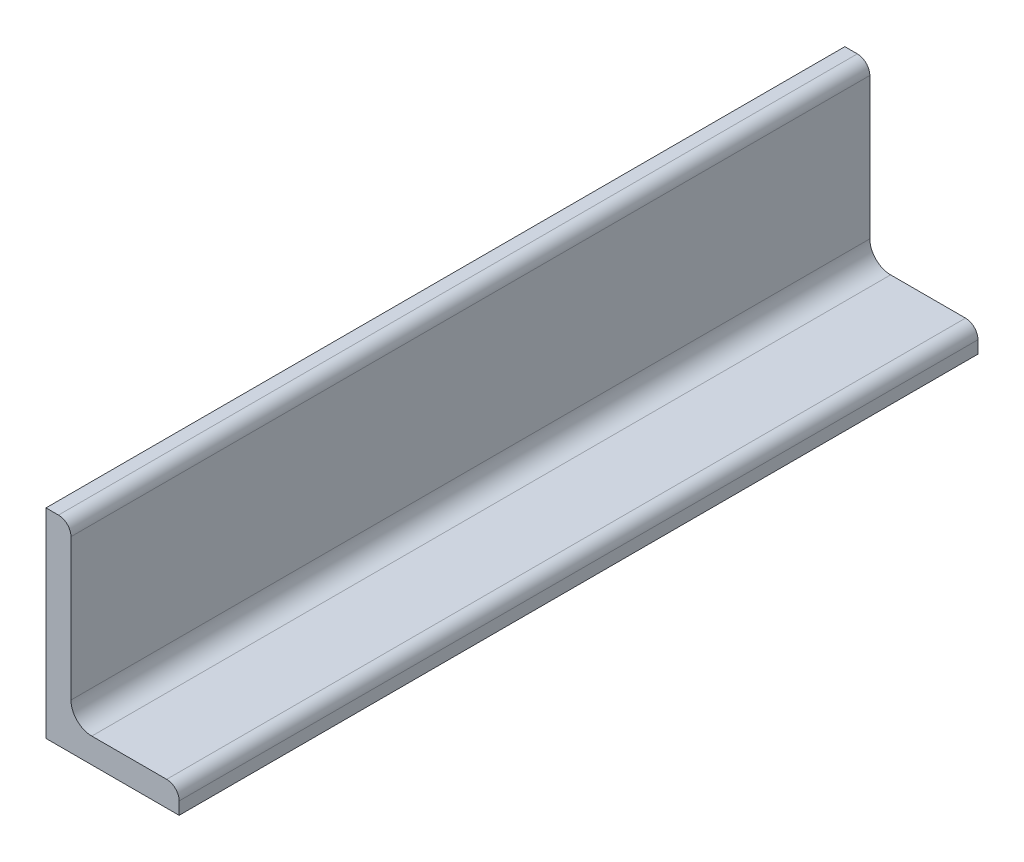
ISO-10303-21;
HEADER;
FILE_DESCRIPTION(('STEP AP214'),'2;1');
FILE_NAME('part.step','',(''),(''),'','','');
FILE_SCHEMA(('AUTOMOTIVE_DESIGN { 1 0 10303 214 1 1 1 1 }'));
ENDSEC;
DATA;
#1=APPLICATION_CONTEXT('core data for automotive mechanical design processes');
#2=APPLICATION_PROTOCOL_DEFINITION('international standard','automotive_design',2000,#1);
#3=PRODUCT_CONTEXT('',#1,'mechanical');
#4=PRODUCT('Part','Part','',(#3));
#5=PRODUCT_RELATED_PRODUCT_CATEGORY('part','',(#4));
#6=PRODUCT_DEFINITION_FORMATION('','',#4);
#7=PRODUCT_DEFINITION_CONTEXT('part definition',#1,'design');
#8=PRODUCT_DEFINITION('design','',#6,#7);
#9=PRODUCT_DEFINITION_SHAPE('','',#8);
#10=(LENGTH_UNIT() NAMED_UNIT(*) SI_UNIT(.MILLI.,.METRE.));
#11=(NAMED_UNIT(*) PLANE_ANGLE_UNIT() SI_UNIT($,.RADIAN.));
#12=(NAMED_UNIT(*) SI_UNIT($,.STERADIAN.) SOLID_ANGLE_UNIT());
#13=UNCERTAINTY_MEASURE_WITH_UNIT(LENGTH_MEASURE(1.E-05),#10,'distance_accuracy_value','');
#14=(GEOMETRIC_REPRESENTATION_CONTEXT(3) GLOBAL_UNCERTAINTY_ASSIGNED_CONTEXT((#13)) GLOBAL_UNIT_ASSIGNED_CONTEXT((#10,
#11,#12)) REPRESENTATION_CONTEXT('',''));
#15=CARTESIAN_POINT('',(0.,0.,0.));
#16=DIRECTION('',(0.,0.,1.));
#17=DIRECTION('',(1.,0.,0.));
#18=AXIS2_PLACEMENT_3D('',#15,#16,#17);
#19=CARTESIAN_POINT('',(0.116507760447575,76.2882459217981,304.8));
#20=DIRECTION('',(1.,0.,0.));
#21=DIRECTION('',(0.,0.,-1.));
#22=AXIS2_PLACEMENT_3D('',#19,#20,#21);
#23=PLANE('',#22);
#24=DIRECTION('',(0.,-1.,0.));
#25=VECTOR('',#24,1.);
#26=CARTESIAN_POINT('',(0.116507760447575,76.2882459217981,0.));
#27=LINE('',#26,#25);
#28=CARTESIAN_POINT('',(0.116507760447575,76.2882459217981,0.));
#29=VERTEX_POINT('',#28);
#30=CARTESIAN_POINT('',(0.116507760447575,0.0882459217980795,0.));
#31=VERTEX_POINT('',#30);
#32=EDGE_CURVE('E135',#29,#31,#27,.T.);
#33=ORIENTED_EDGE('',*,*,#32,.T.);
#34=DIRECTION('',(0.,0.,-1.));
#35=VECTOR('',#34,1.);
#36=CARTESIAN_POINT('',(0.116507760447575,0.0882459217980795,304.8));
#37=LINE('',#36,#35);
#38=CARTESIAN_POINT('',(0.116507760447575,0.0882459217980795,304.8));
#39=VERTEX_POINT('',#38);
#40=EDGE_CURVE('E11',#39,#31,#37,.T.);
#41=ORIENTED_EDGE('',*,*,#40,.F.);
#42=DIRECTION('',(0.,-1.,0.));
#43=VECTOR('',#42,1.);
#44=CARTESIAN_POINT('',(0.116507760447575,76.2882459217981,304.8));
#45=LINE('',#44,#43);
#46=CARTESIAN_POINT('',(0.116507760447575,76.2882459217981,304.8));
#47=VERTEX_POINT('',#46);
#48=EDGE_CURVE('E151',#47,#39,#45,.T.);
#49=ORIENTED_EDGE('',*,*,#48,.F.);
#50=DIRECTION('',(0.,0.,-1.));
#51=VECTOR('',#50,1.);
#52=CARTESIAN_POINT('',(0.116507760447575,76.2882459217981,304.8));
#53=LINE('',#52,#51);
#54=EDGE_CURVE('E131',#47,#29,#53,.T.);
#55=ORIENTED_EDGE('',*,*,#54,.T.);
#56=EDGE_LOOP('',(#33,#41,#49,#55));
#57=FACE_BOUND('',#56,.T.);
#58=ADVANCED_FACE('F33',(#57),#23,.F.);
#59=CARTESIAN_POINT('',(0.116507760447575,0.0882459217980795,304.8));
#60=DIRECTION('',(0.,1.,0.));
#61=DIRECTION('',(0.,0.,1.));
#62=AXIS2_PLACEMENT_3D('',#59,#60,#61);
#63=PLANE('',#62);
#64=DIRECTION('',(1.,0.,0.));
#65=VECTOR('',#64,1.);
#66=CARTESIAN_POINT('',(0.116507760447575,0.0882459217980795,0.));
#67=LINE('',#66,#65);
#68=CARTESIAN_POINT('',(50.9165077604476,0.0882459217980795,0.));
#69=VERTEX_POINT('',#68);
#70=EDGE_CURVE('E138',#31,#69,#67,.T.);
#71=ORIENTED_EDGE('',*,*,#70,.T.);
#72=DIRECTION('',(0.,0.,-1.));
#73=VECTOR('',#72,1.);
#74=CARTESIAN_POINT('',(50.9165077604476,0.0882459217980795,304.8));
#75=LINE('',#74,#73);
#76=CARTESIAN_POINT('',(50.9165077604476,0.0882459217980795,304.8));
#77=VERTEX_POINT('',#76);
#78=EDGE_CURVE('E41',#77,#69,#75,.T.);
#79=ORIENTED_EDGE('',*,*,#78,.F.);
#80=DIRECTION('',(1.,0.,0.));
#81=VECTOR('',#80,1.);
#82=CARTESIAN_POINT('',(0.116507760447575,0.0882459217980795,304.8));
#83=LINE('',#82,#81);
#84=EDGE_CURVE('E95',#39,#77,#83,.T.);
#85=ORIENTED_EDGE('',*,*,#84,.F.);
#86=ORIENTED_EDGE('',*,*,#40,.T.);
#87=EDGE_LOOP('',(#71,#79,#85,#86));
#88=FACE_BOUND('',#87,.T.);
#89=ADVANCED_FACE('F194',(#88),#63,.F.);
#90=CARTESIAN_POINT('',(50.9165077604476,0.0882459217980795,304.8));
#91=DIRECTION('',(-1.,0.,0.));
#92=DIRECTION('',(0.,0.,1.));
#93=AXIS2_PLACEMENT_3D('',#90,#91,#92);
#94=PLANE('',#93);
#95=DIRECTION('',(0.,1.,0.));
#96=VECTOR('',#95,1.);
#97=CARTESIAN_POINT('',(50.9165077604476,0.0882459217980795,0.));
#98=LINE('',#97,#96);
#99=CARTESIAN_POINT('',(50.9165077604476,4.85074592179808,0.));
#100=VERTEX_POINT('',#99);
#101=EDGE_CURVE('E140',#69,#100,#98,.T.);
#102=ORIENTED_EDGE('',*,*,#101,.T.);
#103=DIRECTION('',(0.,0.,-1.));
#104=VECTOR('',#103,1.);
#105=CARTESIAN_POINT('',(50.9165077604476,4.85074592179808,304.8));
#106=LINE('',#105,#104);
#107=CARTESIAN_POINT('',(50.9165077604476,4.85074592179808,304.8));
#108=VERTEX_POINT('',#107);
#109=EDGE_CURVE('E161',#108,#100,#106,.T.);
#110=ORIENTED_EDGE('',*,*,#109,.F.);
#111=DIRECTION('',(0.,1.,0.));
#112=VECTOR('',#111,1.);
#113=CARTESIAN_POINT('',(50.9165077604476,0.0882459217980795,304.8));
#114=LINE('',#113,#112);
#115=EDGE_CURVE('E169',#77,#108,#114,.T.);
#116=ORIENTED_EDGE('',*,*,#115,.F.);
#117=ORIENTED_EDGE('',*,*,#78,.T.);
#118=EDGE_LOOP('',(#102,#110,#116,#117));
#119=FACE_BOUND('',#118,.T.);
#120=ADVANCED_FACE('F167',(#119),#94,.F.);
#121=CARTESIAN_POINT('',(46.1540077604476,4.85074592179808,304.8));
#122=DIRECTION('',(0.,0.,-1.));
#123=DIRECTION('',(-1.,0.,0.));
#124=AXIS2_PLACEMENT_3D('',#121,#122,#123);
#125=CYLINDRICAL_SURFACE('',#124,4.7625);
#126=CARTESIAN_POINT('',(46.1540077604476,4.85074592179808,0.));
#127=DIRECTION('',(0.,0.,1.));
#128=DIRECTION('',(1.,0.,0.));
#129=AXIS2_PLACEMENT_3D('',#126,#127,#128);
#130=CIRCLE('',#129,4.7625);
#131=CARTESIAN_POINT('',(46.1540077604476,9.61324592179808,0.));
#132=VERTEX_POINT('',#131);
#133=EDGE_CURVE('E142',#100,#132,#130,.T.);
#134=ORIENTED_EDGE('',*,*,#133,.T.);
#135=DIRECTION('',(0.,0.,-1.));
#136=VECTOR('',#135,1.);
#137=CARTESIAN_POINT('',(46.1540077604476,9.61324592179808,304.8));
#138=LINE('',#137,#136);
#139=CARTESIAN_POINT('',(46.1540077604476,9.61324592179808,304.8));
#140=VERTEX_POINT('',#139);
#141=EDGE_CURVE('E158',#140,#132,#138,.T.);
#142=ORIENTED_EDGE('',*,*,#141,.F.);
#143=CARTESIAN_POINT('',(46.1540077604476,4.85074592179808,304.8));
#144=DIRECTION('',(0.,0.,1.));
#145=DIRECTION('',(1.,0.,0.));
#146=AXIS2_PLACEMENT_3D('',#143,#144,#145);
#147=CIRCLE('',#146,4.7625);
#148=EDGE_CURVE('E185',#108,#140,#147,.T.);
#149=ORIENTED_EDGE('',*,*,#148,.F.);
#150=ORIENTED_EDGE('',*,*,#109,.T.);
#151=EDGE_LOOP('',(#134,#142,#149,#150));
#152=FACE_BOUND('',#151,.T.);
#153=ADVANCED_FACE('F178',(#152),#125,.T.);
#154=CARTESIAN_POINT('',(46.1540077604476,9.61324592179808,304.8));
#155=DIRECTION('',(0.,-1.,0.));
#156=DIRECTION('',(0.,0.,-1.));
#157=AXIS2_PLACEMENT_3D('',#154,#155,#156);
#158=PLANE('',#157);
#159=DIRECTION('',(-1.,0.,0.));
#160=VECTOR('',#159,1.);
#161=CARTESIAN_POINT('',(46.1540077604476,9.61324592179808,0.));
#162=LINE('',#161,#160);
#163=CARTESIAN_POINT('',(17.5790077604476,9.61324592179808,0.));
#164=VERTEX_POINT('',#163);
#165=EDGE_CURVE('E144',#132,#164,#162,.T.);
#166=ORIENTED_EDGE('',*,*,#165,.T.);
#167=DIRECTION('',(0.,0.,-1.));
#168=VECTOR('',#167,1.);
#169=CARTESIAN_POINT('',(17.5790077604476,9.61324592179808,304.8));
#170=LINE('',#169,#168);
#171=CARTESIAN_POINT('',(17.5790077604476,9.61324592179808,304.8));
#172=VERTEX_POINT('',#171);
#173=EDGE_CURVE('E155',#172,#164,#170,.T.);
#174=ORIENTED_EDGE('',*,*,#173,.F.);
#175=DIRECTION('',(-1.,0.,0.));
#176=VECTOR('',#175,1.);
#177=CARTESIAN_POINT('',(46.1540077604476,9.61324592179808,304.8));
#178=LINE('',#177,#176);
#179=EDGE_CURVE('E184',#140,#172,#178,.T.);
#180=ORIENTED_EDGE('',*,*,#179,.F.);
#181=ORIENTED_EDGE('',*,*,#141,.T.);
#182=EDGE_LOOP('',(#166,#174,#180,#181));
#183=FACE_BOUND('',#182,.T.);
#184=ADVANCED_FACE('F182',(#183),#158,.F.);
#185=CARTESIAN_POINT('',(17.5790077604476,17.5507459217981,304.8));
#186=DIRECTION('',(0.,0.,-1.));
#187=DIRECTION('',(-1.,0.,0.));
#188=AXIS2_PLACEMENT_3D('',#185,#186,#187);
#189=CYLINDRICAL_SURFACE('',#188,7.93749999999999);
#190=CARTESIAN_POINT('',(17.5790077604476,17.5507459217981,0.));
#191=DIRECTION('',(0.,0.,-1.));
#192=DIRECTION('',(1.,0.,0.));
#193=AXIS2_PLACEMENT_3D('',#190,#191,#192);
#194=CIRCLE('',#193,7.93749999999999);
#195=CARTESIAN_POINT('',(9.64150776044757,17.5507459217981,0.));
#196=VERTEX_POINT('',#195);
#197=EDGE_CURVE('E146',#164,#196,#194,.T.);
#198=ORIENTED_EDGE('',*,*,#197,.T.);
#199=DIRECTION('',(0.,0.,-1.));
#200=VECTOR('',#199,1.);
#201=CARTESIAN_POINT('',(9.64150776044757,17.5507459217981,304.8));
#202=LINE('',#201,#200);
#203=CARTESIAN_POINT('',(9.64150776044757,17.5507459217981,304.8));
#204=VERTEX_POINT('',#203);
#205=EDGE_CURVE('E126',#204,#196,#202,.T.);
#206=ORIENTED_EDGE('',*,*,#205,.F.);
#207=CARTESIAN_POINT('',(17.5790077604476,17.5507459217981,304.8));
#208=DIRECTION('',(0.,0.,-1.));
#209=DIRECTION('',(1.,0.,0.));
#210=AXIS2_PLACEMENT_3D('',#207,#208,#209);
#211=CIRCLE('',#210,7.93749999999999);
#212=EDGE_CURVE('E117',#172,#204,#211,.T.);
#213=ORIENTED_EDGE('',*,*,#212,.F.);
#214=ORIENTED_EDGE('',*,*,#173,.T.);
#215=EDGE_LOOP('',(#198,#206,#213,#214));
#216=FACE_BOUND('',#215,.T.);
#217=ADVANCED_FACE('F206',(#216),#189,.F.);
#218=CARTESIAN_POINT('',(9.64150776044758,17.5507459217981,304.8));
#219=DIRECTION('',(-1.,0.,0.));
#220=DIRECTION('',(0.,0.,1.));
#221=AXIS2_PLACEMENT_3D('',#218,#219,#220);
#222=PLANE('',#221);
#223=DIRECTION('',(0.,1.,0.));
#224=VECTOR('',#223,1.);
#225=CARTESIAN_POINT('',(9.64150776044758,17.5507459217981,0.));
#226=LINE('',#225,#224);
#227=CARTESIAN_POINT('',(9.64150776044758,71.5257459217981,0.));
#228=VERTEX_POINT('',#227);
#229=EDGE_CURVE('E125',#196,#228,#226,.T.);
#230=ORIENTED_EDGE('',*,*,#229,.T.);
#231=DIRECTION('',(0.,0.,-1.));
#232=VECTOR('',#231,1.);
#233=CARTESIAN_POINT('',(9.64150776044758,71.5257459217981,304.8));
#234=LINE('',#233,#232);
#235=CARTESIAN_POINT('',(9.64150776044758,71.5257459217981,304.8));
#236=VERTEX_POINT('',#235);
#237=EDGE_CURVE('E122',#236,#228,#234,.T.);
#238=ORIENTED_EDGE('',*,*,#237,.F.);
#239=DIRECTION('',(0.,1.,0.));
#240=VECTOR('',#239,1.);
#241=CARTESIAN_POINT('',(9.64150776044758,17.5507459217981,304.8));
#242=LINE('',#241,#240);
#243=EDGE_CURVE('E111',#204,#236,#242,.T.);
#244=ORIENTED_EDGE('',*,*,#243,.F.);
#245=ORIENTED_EDGE('',*,*,#205,.T.);
#246=EDGE_LOOP('',(#230,#238,#244,#245));
#247=FACE_BOUND('',#246,.T.);
#248=ADVANCED_FACE('F123',(#247),#222,.F.);
#249=CARTESIAN_POINT('',(4.87900776044757,71.5257459217981,304.8));
#250=DIRECTION('',(0.,0.,-1.));
#251=DIRECTION('',(-1.,0.,0.));
#252=AXIS2_PLACEMENT_3D('',#249,#250,#251);
#253=CYLINDRICAL_SURFACE('',#252,4.7625);
#254=CARTESIAN_POINT('',(4.87900776044757,71.5257459217981,0.));
#255=DIRECTION('',(0.,0.,1.));
#256=DIRECTION('',(1.,0.,0.));
#257=AXIS2_PLACEMENT_3D('',#254,#255,#256);
#258=CIRCLE('',#257,4.7625);
#259=CARTESIAN_POINT('',(4.87900776044758,76.2882459217981,0.));
#260=VERTEX_POINT('',#259);
#261=EDGE_CURVE('E81',#228,#260,#258,.T.);
#262=ORIENTED_EDGE('',*,*,#261,.T.);
#263=DIRECTION('',(0.,0.,-1.));
#264=VECTOR('',#263,1.);
#265=CARTESIAN_POINT('',(4.87900776044758,76.2882459217981,304.8));
#266=LINE('',#265,#264);
#267=CARTESIAN_POINT('',(4.87900776044758,76.2882459217981,304.8));
#268=VERTEX_POINT('',#267);
#269=EDGE_CURVE('E127',#268,#260,#266,.T.);
#270=ORIENTED_EDGE('',*,*,#269,.F.);
#271=CARTESIAN_POINT('',(4.87900776044757,71.5257459217981,304.8));
#272=DIRECTION('',(0.,0.,1.));
#273=DIRECTION('',(1.,0.,0.));
#274=AXIS2_PLACEMENT_3D('',#271,#272,#273);
#275=CIRCLE('',#274,4.7625);
#276=EDGE_CURVE('E115',#236,#268,#275,.T.);
#277=ORIENTED_EDGE('',*,*,#276,.F.);
#278=ORIENTED_EDGE('',*,*,#237,.T.);
#279=EDGE_LOOP('',(#262,#270,#277,#278));
#280=FACE_BOUND('',#279,.T.);
#281=ADVANCED_FACE('F129',(#280),#253,.T.);
#282=CARTESIAN_POINT('',(4.87900776044758,76.2882459217981,304.8));
#283=DIRECTION('',(0.,-1.,0.));
#284=DIRECTION('',(0.,0.,-1.));
#285=AXIS2_PLACEMENT_3D('',#282,#283,#284);
#286=PLANE('',#285);
#287=DIRECTION('',(-1.,0.,0.));
#288=VECTOR('',#287,1.);
#289=CARTESIAN_POINT('',(4.87900776044758,76.2882459217981,0.));
#290=LINE('',#289,#288);
#291=EDGE_CURVE('E87',#260,#29,#290,.T.);
#292=ORIENTED_EDGE('',*,*,#291,.T.);
#293=ORIENTED_EDGE('',*,*,#54,.F.);
#294=DIRECTION('',(-1.,0.,0.));
#295=VECTOR('',#294,1.);
#296=CARTESIAN_POINT('',(4.87900776044758,76.2882459217981,304.8));
#297=LINE('',#296,#295);
#298=EDGE_CURVE('E49',#268,#47,#297,.T.);
#299=ORIENTED_EDGE('',*,*,#298,.F.);
#300=ORIENTED_EDGE('',*,*,#269,.T.);
#301=EDGE_LOOP('',(#292,#293,#299,#300));
#302=FACE_BOUND('',#301,.T.);
#303=ADVANCED_FACE('F214',(#302),#286,.F.);
#304=CARTESIAN_POINT('',(46.1540077604476,4.85074592179808,304.8));
#305=DIRECTION('',(0.,0.,1.));
#306=DIRECTION('',(1.,0.,0.));
#307=AXIS2_PLACEMENT_3D('',#304,#305,#306);
#308=PLANE('',#307);
#309=ORIENTED_EDGE('',*,*,#48,.T.);
#310=ORIENTED_EDGE('',*,*,#84,.T.);
#311=ORIENTED_EDGE('',*,*,#115,.T.);
#312=ORIENTED_EDGE('',*,*,#148,.T.);
#313=ORIENTED_EDGE('',*,*,#179,.T.);
#314=ORIENTED_EDGE('',*,*,#212,.T.);
#315=ORIENTED_EDGE('',*,*,#243,.T.);
#316=ORIENTED_EDGE('',*,*,#276,.T.);
#317=ORIENTED_EDGE('',*,*,#298,.T.);
#318=EDGE_LOOP('',(#309,#310,#311,#312,#313,#314,#315,#316,#317));
#319=FACE_BOUND('',#318,.T.);
#320=ADVANCED_FACE('F113',(#319),#308,.T.);
#321=CARTESIAN_POINT('',(46.1540077604476,4.85074592179808,0.));
#322=DIRECTION('',(0.,0.,1.));
#323=DIRECTION('',(1.,0.,0.));
#324=AXIS2_PLACEMENT_3D('',#321,#322,#323);
#325=PLANE('',#324);
#326=ORIENTED_EDGE('',*,*,#32,.F.);
#327=ORIENTED_EDGE('',*,*,#291,.F.);
#328=ORIENTED_EDGE('',*,*,#261,.F.);
#329=ORIENTED_EDGE('',*,*,#229,.F.);
#330=ORIENTED_EDGE('',*,*,#197,.F.);
#331=ORIENTED_EDGE('',*,*,#165,.F.);
#332=ORIENTED_EDGE('',*,*,#133,.F.);
#333=ORIENTED_EDGE('',*,*,#101,.F.);
#334=ORIENTED_EDGE('',*,*,#70,.F.);
#335=EDGE_LOOP('',(#326,#327,#328,#329,#330,#331,#332,#333,#334));
#336=FACE_BOUND('',#335,.T.);
#337=ADVANCED_FACE('F173',(#336),#325,.F.);
#338=CLOSED_SHELL('',(#58,#89,#120,#153,#184,#217,#248,#281,#303,#320,#337));
#339=MANIFOLD_SOLID_BREP('B2',#338);
#340=ADVANCED_BREP_SHAPE_REPRESENTATION('',(#18,#339),#14);
#341=SHAPE_DEFINITION_REPRESENTATION(#9,#340);
ENDSEC;
END-ISO-10303-21;
